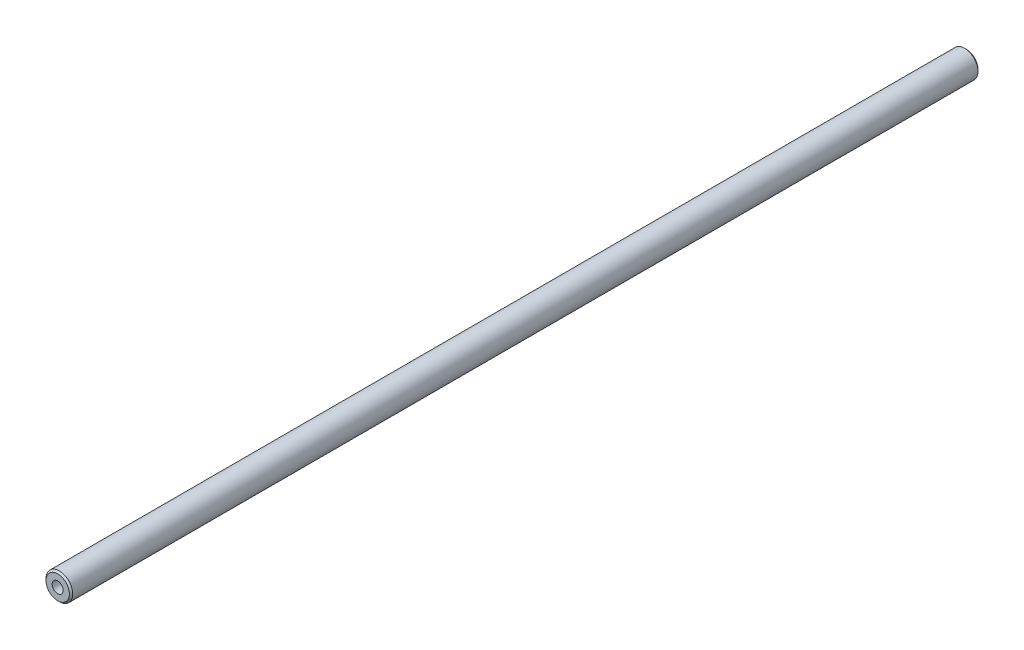
ISO-10303-21;
HEADER;
FILE_DESCRIPTION(('STEP AP214'),'2;1');
FILE_NAME('part.step','',(''),(''),'','','');
FILE_SCHEMA(('AUTOMOTIVE_DESIGN { 1 0 10303 214 1 1 1 1 }'));
ENDSEC;
DATA;
#1=APPLICATION_CONTEXT('core data for automotive mechanical design processes');
#2=APPLICATION_PROTOCOL_DEFINITION('international standard','automotive_design',2000,#1);
#3=PRODUCT_CONTEXT('',#1,'mechanical');
#4=PRODUCT('Part','Part','',(#3));
#5=PRODUCT_RELATED_PRODUCT_CATEGORY('part','',(#4));
#6=PRODUCT_DEFINITION_FORMATION('','',#4);
#7=PRODUCT_DEFINITION_CONTEXT('part definition',#1,'design');
#8=PRODUCT_DEFINITION('design','',#6,#7);
#9=PRODUCT_DEFINITION_SHAPE('','',#8);
#10=(LENGTH_UNIT() NAMED_UNIT(*) SI_UNIT(.MILLI.,.METRE.));
#11=(NAMED_UNIT(*) PLANE_ANGLE_UNIT() SI_UNIT($,.RADIAN.));
#12=(NAMED_UNIT(*) SI_UNIT($,.STERADIAN.) SOLID_ANGLE_UNIT());
#13=UNCERTAINTY_MEASURE_WITH_UNIT(LENGTH_MEASURE(1.E-05),#10,'distance_accuracy_value','');
#14=(GEOMETRIC_REPRESENTATION_CONTEXT(3) GLOBAL_UNCERTAINTY_ASSIGNED_CONTEXT((#13)) GLOBAL_UNIT_ASSIGNED_CONTEXT((#10,
#11,#12)) REPRESENTATION_CONTEXT('',''));
#15=CARTESIAN_POINT('',(0.,0.,0.));
#16=DIRECTION('',(0.,0.,1.));
#17=DIRECTION('',(1.,0.,0.));
#18=AXIS2_PLACEMENT_3D('',#15,#16,#17);
#19=CARTESIAN_POINT('',(0.,0.,260.499999999865));
#20=DIRECTION('',(0.,0.,1.));
#21=DIRECTION('',(1.,0.,0.));
#22=AXIS2_PLACEMENT_3D('',#19,#20,#21);
#23=CONICAL_SURFACE('',#22,1.64999999981319,1.02974425845815);
#24=CARTESIAN_POINT('',(-1.98951966012828E-10,0.,259.508579978444));
#25=VERTEX_POINT('',#24);
#26=VERTEX_LOOP('',#25);
#27=FACE_BOUND('',#26,.T.);
#28=CARTESIAN_POINT('',(0.,0.,260.5));
#29=DIRECTION('',(0.,0.,1.));
#30=DIRECTION('',(1.,0.,0.));
#31=AXIS2_PLACEMENT_3D('',#28,#29,#30);
#32=CIRCLE('',#31,1.64999999999999);
#33=CARTESIAN_POINT('',(1.64999999999999,0.,260.5));
#34=VERTEX_POINT('',#33);
#35=EDGE_CURVE('E37',#34,#34,#32,.T.);
#36=ORIENTED_EDGE('',*,*,#35,.T.);
#37=EDGE_LOOP('',(#36));
#38=FACE_BOUND('',#37,.T.);
#39=ADVANCED_FACE('F17',(#27,#38),#23,.F.);
#40=CARTESIAN_POINT('',(0.,0.,11.5000000000123));
#41=DIRECTION('',(0.,0.,-1.));
#42=DIRECTION('',(-1.,0.,0.));
#43=AXIS2_PLACEMENT_3D('',#40,#41,#42);
#44=CONICAL_SURFACE('',#43,1.65000000004056,1.02974425860513);
#45=CARTESIAN_POINT('',(0.,-5.68426539819307E-11,12.4914200214619));
#46=VERTEX_POINT('',#45);
#47=VERTEX_LOOP('',#46);
#48=FACE_BOUND('',#47,.T.);
#49=CARTESIAN_POINT('',(0.,0.,11.5));
#50=DIRECTION('',(0.,0.,-1.));
#51=DIRECTION('',(0.,1.,0.));
#52=AXIS2_PLACEMENT_3D('',#49,#50,#51);
#53=CIRCLE('',#52,1.64999999999999);
#54=CARTESIAN_POINT('',(0.,1.64999999999999,11.5));
#55=VERTEX_POINT('',#54);
#56=EDGE_CURVE('E39',#55,#55,#53,.T.);
#57=ORIENTED_EDGE('',*,*,#56,.T.);
#58=EDGE_LOOP('',(#57));
#59=FACE_BOUND('',#58,.T.);
#60=ADVANCED_FACE('F34',(#48,#59),#44,.F.);
#61=CARTESIAN_POINT('',(0.,0.,272.));
#62=DIRECTION('',(0.,0.,1.));
#63=DIRECTION('',(1.,0.,0.));
#64=AXIS2_PLACEMENT_3D('',#61,#62,#63);
#65=CYLINDRICAL_SURFACE('',#64,1.64999999999999);
#66=CARTESIAN_POINT('',(0.,0.,272.));
#67=DIRECTION('',(0.,0.,1.));
#68=DIRECTION('',(1.,0.,0.));
#69=AXIS2_PLACEMENT_3D('',#66,#67,#68);
#70=CIRCLE('',#69,1.64999999999999);
#71=CARTESIAN_POINT('',(1.64999999999999,0.,272.));
#72=VERTEX_POINT('',#71);
#73=EDGE_CURVE('E20',#72,#72,#70,.F.);
#74=ORIENTED_EDGE('',*,*,#73,.F.);
#75=EDGE_LOOP('',(#74));
#76=FACE_BOUND('',#75,.T.);
#77=ORIENTED_EDGE('',*,*,#35,.F.);
#78=EDGE_LOOP('',(#77));
#79=FACE_BOUND('',#78,.T.);
#80=ADVANCED_FACE('F59',(#76,#79),#65,.F.);
#81=CARTESIAN_POINT('',(0.,0.,0.));
#82=DIRECTION('',(0.,0.,-1.));
#83=DIRECTION('',(0.,1.,0.));
#84=AXIS2_PLACEMENT_3D('',#81,#82,#83);
#85=CYLINDRICAL_SURFACE('',#84,1.64999999999999);
#86=ORIENTED_EDGE('',*,*,#56,.F.);
#87=EDGE_LOOP('',(#86));
#88=FACE_BOUND('',#87,.T.);
#89=CARTESIAN_POINT('',(0.,0.,0.));
#90=DIRECTION('',(0.,0.,-1.));
#91=DIRECTION('',(0.,1.,0.));
#92=AXIS2_PLACEMENT_3D('',#89,#90,#91);
#93=CIRCLE('',#92,1.64999999999999);
#94=CARTESIAN_POINT('',(0.,1.64999999999999,0.));
#95=VERTEX_POINT('',#94);
#96=EDGE_CURVE('E50',#95,#95,#93,.T.);
#97=ORIENTED_EDGE('',*,*,#96,.T.);
#98=EDGE_LOOP('',(#97));
#99=FACE_BOUND('',#98,.T.);
#100=ADVANCED_FACE('F61',(#88,#99),#85,.F.);
#101=CARTESIAN_POINT('',(0.,0.,272.));
#102=DIRECTION('',(0.,0.,1.));
#103=DIRECTION('',(1.,0.,0.));
#104=AXIS2_PLACEMENT_3D('',#101,#102,#103);
#105=PLANE('',#104);
#106=CARTESIAN_POINT('',(0.,0.,271.999999999991));
#107=DIRECTION('',(0.,0.,-1.));
#108=DIRECTION('',(-1.,0.,0.));
#109=AXIS2_PLACEMENT_3D('',#106,#107,#108);
#110=CIRCLE('',#109,3.50000000003092);
#111=CARTESIAN_POINT('',(-3.50000000003092,0.,271.999999999991));
#112=VERTEX_POINT('',#111);
#113=EDGE_CURVE('E48',#112,#112,#110,.T.);
#114=ORIENTED_EDGE('',*,*,#113,.F.);
#115=EDGE_LOOP('',(#114));
#116=FACE_BOUND('',#115,.T.);
#117=ORIENTED_EDGE('',*,*,#73,.T.);
#118=EDGE_LOOP('',(#117));
#119=FACE_BOUND('',#118,.T.);
#120=ADVANCED_FACE('F57',(#116,#119),#105,.T.);
#121=CARTESIAN_POINT('',(0.,0.,0.));
#122=DIRECTION('',(0.,0.,1.));
#123=DIRECTION('',(1.,0.,0.));
#124=AXIS2_PLACEMENT_3D('',#121,#122,#123);
#125=PLANE('',#124);
#126=CARTESIAN_POINT('',(0.,0.,0.));
#127=DIRECTION('',(0.,0.,1.));
#128=DIRECTION('',(1.,0.,0.));
#129=AXIS2_PLACEMENT_3D('',#126,#127,#128);
#130=CIRCLE('',#129,3.50000000008777);
#131=CARTESIAN_POINT('',(3.50000000008777,0.,0.));
#132=VERTEX_POINT('',#131);
#133=EDGE_CURVE('E45',#132,#132,#130,.T.);
#134=ORIENTED_EDGE('',*,*,#133,.F.);
#135=EDGE_LOOP('',(#134));
#136=FACE_BOUND('',#135,.T.);
#137=ORIENTED_EDGE('',*,*,#96,.F.);
#138=EDGE_LOOP('',(#137));
#139=FACE_BOUND('',#138,.T.);
#140=ADVANCED_FACE('F85',(#136,#139),#125,.F.);
#141=CARTESIAN_POINT('',(0.,0.,271.500000000117));
#142=DIRECTION('',(0.,0.,-1.));
#143=DIRECTION('',(-1.,0.,0.));
#144=AXIS2_PLACEMENT_3D('',#141,#142,#143);
#145=CONICAL_SURFACE('',#144,3.99999999990541,0.785398163397448);
#146=CARTESIAN_POINT('',(0.,0.,271.5));
#147=DIRECTION('',(0.,0.,-1.));
#148=DIRECTION('',(-1.,0.,0.));
#149=AXIS2_PLACEMENT_3D('',#146,#147,#148);
#150=CIRCLE('',#149,4.);
#151=CARTESIAN_POINT('',(-4.,0.,271.5));
#152=VERTEX_POINT('',#151);
#153=EDGE_CURVE('E26',#152,#152,#150,.T.);
#154=ORIENTED_EDGE('',*,*,#153,.F.);
#155=EDGE_LOOP('',(#154));
#156=FACE_BOUND('',#155,.T.);
#157=ORIENTED_EDGE('',*,*,#113,.T.);
#158=EDGE_LOOP('',(#157));
#159=FACE_BOUND('',#158,.T.);
#160=ADVANCED_FACE('F78',(#156,#159),#145,.T.);
#161=CARTESIAN_POINT('',(0.,0.,0.499999999931333));
#162=DIRECTION('',(0.,0.,1.));
#163=DIRECTION('',(1.,0.,0.));
#164=AXIS2_PLACEMENT_3D('',#161,#162,#163);
#165=CONICAL_SURFACE('',#164,3.99999999996226,0.785398163340605);
#166=CARTESIAN_POINT('',(0.,0.,0.500000000000056));
#167=DIRECTION('',(0.,0.,-1.));
#168=DIRECTION('',(-1.,0.,0.));
#169=AXIS2_PLACEMENT_3D('',#166,#167,#168);
#170=CIRCLE('',#169,4.);
#171=CARTESIAN_POINT('',(-4.,0.,0.500000000000056));
#172=VERTEX_POINT('',#171);
#173=EDGE_CURVE('E10',#172,#172,#170,.F.);
#174=ORIENTED_EDGE('',*,*,#173,.F.);
#175=EDGE_LOOP('',(#174));
#176=FACE_BOUND('',#175,.T.);
#177=ORIENTED_EDGE('',*,*,#133,.T.);
#178=EDGE_LOOP('',(#177));
#179=FACE_BOUND('',#178,.T.);
#180=ADVANCED_FACE('F72',(#176,#179),#165,.T.);
#181=CARTESIAN_POINT('',(0.,0.,272.));
#182=DIRECTION('',(0.,0.,-1.));
#183=DIRECTION('',(-1.,0.,0.));
#184=AXIS2_PLACEMENT_3D('',#181,#182,#183);
#185=CYLINDRICAL_SURFACE('',#184,4.);
#186=ORIENTED_EDGE('',*,*,#173,.T.);
#187=EDGE_LOOP('',(#186));
#188=FACE_BOUND('',#187,.T.);
#189=ORIENTED_EDGE('',*,*,#153,.T.);
#190=EDGE_LOOP('',(#189));
#191=FACE_BOUND('',#190,.T.);
#192=ADVANCED_FACE('F70',(#188,#191),#185,.T.);
#193=CLOSED_SHELL('',(#39,#60,#80,#100,#120,#140,#160,#180,#192));
#194=MANIFOLD_SOLID_BREP('B1',#193);
#195=ADVANCED_BREP_SHAPE_REPRESENTATION('',(#18,#194),#14);
#196=SHAPE_DEFINITION_REPRESENTATION(#9,#195);
ENDSEC;
END-ISO-10303-21;
